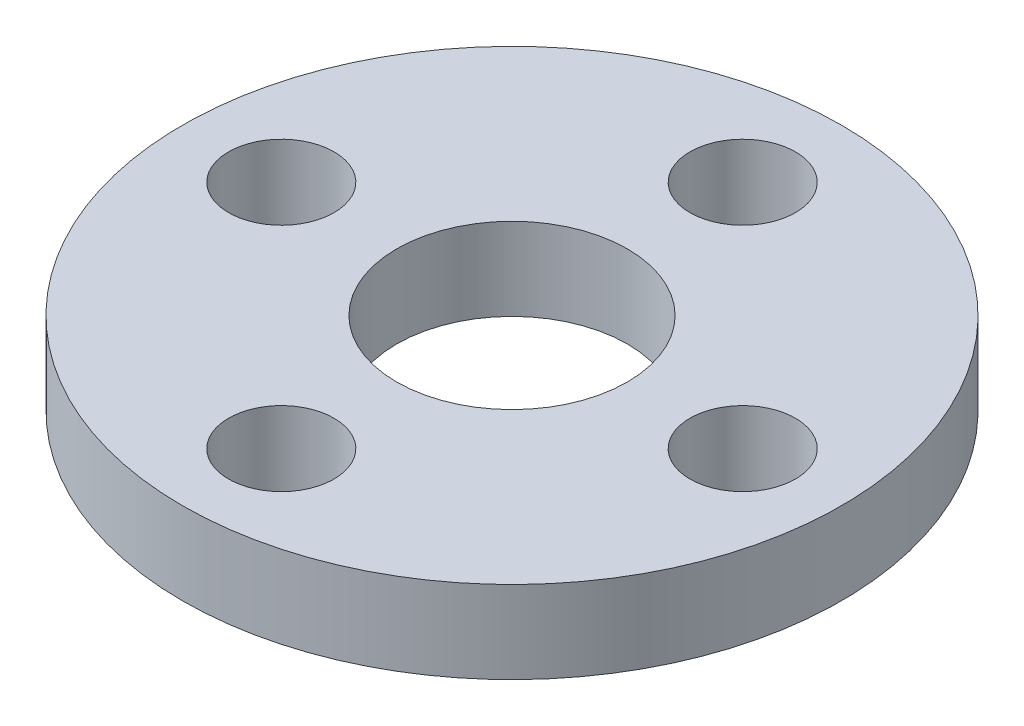
ISO-10303-21;
HEADER;
FILE_DESCRIPTION(('STEP AP214'),'2;1');
FILE_NAME('part.step','',(''),(''),'','','');
FILE_SCHEMA(('AUTOMOTIVE_DESIGN { 1 0 10303 214 1 1 1 1 }'));
ENDSEC;
DATA;
#1=APPLICATION_CONTEXT('core data for automotive mechanical design processes');
#2=APPLICATION_PROTOCOL_DEFINITION('international standard','automotive_design',2000,#1);
#3=PRODUCT_CONTEXT('',#1,'mechanical');
#4=PRODUCT('Part','Part','',(#3));
#5=PRODUCT_RELATED_PRODUCT_CATEGORY('part','',(#4));
#6=PRODUCT_DEFINITION_FORMATION('','',#4);
#7=PRODUCT_DEFINITION_CONTEXT('part definition',#1,'design');
#8=PRODUCT_DEFINITION('design','',#6,#7);
#9=PRODUCT_DEFINITION_SHAPE('','',#8);
#10=(LENGTH_UNIT() NAMED_UNIT(*) SI_UNIT(.MILLI.,.METRE.));
#11=(NAMED_UNIT(*) PLANE_ANGLE_UNIT() SI_UNIT($,.RADIAN.));
#12=(NAMED_UNIT(*) SI_UNIT($,.STERADIAN.) SOLID_ANGLE_UNIT());
#13=UNCERTAINTY_MEASURE_WITH_UNIT(LENGTH_MEASURE(1.E-05),#10,'distance_accuracy_value','');
#14=(GEOMETRIC_REPRESENTATION_CONTEXT(3) GLOBAL_UNCERTAINTY_ASSIGNED_CONTEXT((#13)) GLOBAL_UNIT_ASSIGNED_CONTEXT((#10,
#11,#12)) REPRESENTATION_CONTEXT('',''));
#15=CARTESIAN_POINT('',(0.,0.,0.));
#16=DIRECTION('',(0.,0.,1.));
#17=DIRECTION('',(1.,0.,0.));
#18=AXIS2_PLACEMENT_3D('',#15,#16,#17);
#19=CARTESIAN_POINT('',(0.,2.5,0.));
#20=DIRECTION('',(0.,1.,0.));
#21=DIRECTION('',(0.,0.,1.));
#22=AXIS2_PLACEMENT_3D('',#19,#20,#21);
#23=PLANE('',#22);
#24=CARTESIAN_POINT('',(0.,2.5,7.));
#25=DIRECTION('',(0.,1.,0.));
#26=DIRECTION('',(0.,0.,-1.));
#27=AXIS2_PLACEMENT_3D('',#24,#25,#26);
#28=CIRCLE('',#27,1.6);
#29=CARTESIAN_POINT('',(0.,2.5,5.4));
#30=VERTEX_POINT('',#29);
#31=EDGE_CURVE('E76',#30,#30,#28,.T.);
#32=ORIENTED_EDGE('',*,*,#31,.F.);
#33=EDGE_LOOP('',(#32));
#34=FACE_BOUND('',#33,.T.);
#35=CARTESIAN_POINT('',(7.,2.5,0.));
#36=DIRECTION('',(0.,1.,0.));
#37=DIRECTION('',(0.,0.,1.));
#38=AXIS2_PLACEMENT_3D('',#35,#36,#37);
#39=CIRCLE('',#38,1.6);
#40=CARTESIAN_POINT('',(7.,2.5,1.6));
#41=VERTEX_POINT('',#40);
#42=EDGE_CURVE('E60',#41,#41,#39,.T.);
#43=ORIENTED_EDGE('',*,*,#42,.F.);
#44=EDGE_LOOP('',(#43));
#45=FACE_BOUND('',#44,.T.);
#46=CARTESIAN_POINT('',(0.,2.5,0.));
#47=DIRECTION('',(0.,1.,0.));
#48=DIRECTION('',(0.,0.,1.));
#49=AXIS2_PLACEMENT_3D('',#46,#47,#48);
#50=CIRCLE('',#49,10.);
#51=CARTESIAN_POINT('',(0.,2.5,10.));
#52=VERTEX_POINT('',#51);
#53=EDGE_CURVE('E10',#52,#52,#50,.T.);
#54=ORIENTED_EDGE('',*,*,#53,.T.);
#55=EDGE_LOOP('',(#54));
#56=FACE_BOUND('',#55,.T.);
#57=CARTESIAN_POINT('',(0.,2.5,-7.));
#58=DIRECTION('',(0.,1.,0.));
#59=DIRECTION('',(0.,0.,1.));
#60=AXIS2_PLACEMENT_3D('',#57,#58,#59);
#61=CIRCLE('',#60,1.6);
#62=CARTESIAN_POINT('',(0.,2.5,-5.4));
#63=VERTEX_POINT('',#62);
#64=EDGE_CURVE('E54',#63,#63,#61,.T.);
#65=ORIENTED_EDGE('',*,*,#64,.F.);
#66=EDGE_LOOP('',(#65));
#67=FACE_BOUND('',#66,.T.);
#68=CARTESIAN_POINT('',(0.,2.5,0.));
#69=DIRECTION('',(0.,1.,0.));
#70=DIRECTION('',(0.,0.,1.));
#71=AXIS2_PLACEMENT_3D('',#68,#69,#70);
#72=CIRCLE('',#71,3.5);
#73=CARTESIAN_POINT('',(0.,2.5,3.5));
#74=VERTEX_POINT('',#73);
#75=EDGE_CURVE('E68',#74,#74,#72,.T.);
#76=ORIENTED_EDGE('',*,*,#75,.F.);
#77=EDGE_LOOP('',(#76));
#78=FACE_BOUND('',#77,.T.);
#79=CARTESIAN_POINT('',(-7.,2.5,0.));
#80=DIRECTION('',(0.,1.,0.));
#81=DIRECTION('',(0.,0.,-1.));
#82=AXIS2_PLACEMENT_3D('',#79,#80,#81);
#83=CIRCLE('',#82,1.6);
#84=CARTESIAN_POINT('',(-7.,2.5,-1.6));
#85=VERTEX_POINT('',#84);
#86=EDGE_CURVE('E84',#85,#85,#83,.T.);
#87=ORIENTED_EDGE('',*,*,#86,.F.);
#88=EDGE_LOOP('',(#87));
#89=FACE_BOUND('',#88,.T.);
#90=ADVANCED_FACE('F41',(#34,#45,#56,#67,#78,#89),#23,.T.);
#91=CARTESIAN_POINT('',(0.,0.,0.));
#92=DIRECTION('',(0.,1.,0.));
#93=DIRECTION('',(0.,0.,1.));
#94=AXIS2_PLACEMENT_3D('',#91,#92,#93);
#95=PLANE('',#94);
#96=CARTESIAN_POINT('',(0.,0.,0.));
#97=DIRECTION('',(0.,1.,0.));
#98=DIRECTION('',(0.,0.,1.));
#99=AXIS2_PLACEMENT_3D('',#96,#97,#98);
#100=CIRCLE('',#99,10.);
#101=CARTESIAN_POINT('',(0.,0.,10.));
#102=VERTEX_POINT('',#101);
#103=EDGE_CURVE('E45',#102,#102,#100,.T.);
#104=ORIENTED_EDGE('',*,*,#103,.F.);
#105=EDGE_LOOP('',(#104));
#106=FACE_BOUND('',#105,.T.);
#107=CARTESIAN_POINT('',(0.,0.,-7.));
#108=DIRECTION('',(0.,1.,0.));
#109=DIRECTION('',(0.,0.,1.));
#110=AXIS2_PLACEMENT_3D('',#107,#108,#109);
#111=CIRCLE('',#110,1.6);
#112=CARTESIAN_POINT('',(0.,0.,-5.4));
#113=VERTEX_POINT('',#112);
#114=EDGE_CURVE('E56',#113,#113,#111,.T.);
#115=ORIENTED_EDGE('',*,*,#114,.T.);
#116=EDGE_LOOP('',(#115));
#117=FACE_BOUND('',#116,.T.);
#118=CARTESIAN_POINT('',(7.,0.,0.));
#119=DIRECTION('',(0.,1.,0.));
#120=DIRECTION('',(0.,0.,1.));
#121=AXIS2_PLACEMENT_3D('',#118,#119,#120);
#122=CIRCLE('',#121,1.6);
#123=CARTESIAN_POINT('',(7.,0.,1.6));
#124=VERTEX_POINT('',#123);
#125=EDGE_CURVE('E64',#124,#124,#122,.T.);
#126=ORIENTED_EDGE('',*,*,#125,.T.);
#127=EDGE_LOOP('',(#126));
#128=FACE_BOUND('',#127,.T.);
#129=CARTESIAN_POINT('',(0.,0.,0.));
#130=DIRECTION('',(0.,1.,0.));
#131=DIRECTION('',(0.,0.,1.));
#132=AXIS2_PLACEMENT_3D('',#129,#130,#131);
#133=CIRCLE('',#132,3.5);
#134=CARTESIAN_POINT('',(0.,0.,3.5));
#135=VERTEX_POINT('',#134);
#136=EDGE_CURVE('E72',#135,#135,#133,.T.);
#137=ORIENTED_EDGE('',*,*,#136,.T.);
#138=EDGE_LOOP('',(#137));
#139=FACE_BOUND('',#138,.T.);
#140=CARTESIAN_POINT('',(0.,0.,7.));
#141=DIRECTION('',(0.,1.,0.));
#142=DIRECTION('',(0.,0.,-1.));
#143=AXIS2_PLACEMENT_3D('',#140,#141,#142);
#144=CIRCLE('',#143,1.6);
#145=CARTESIAN_POINT('',(0.,0.,5.4));
#146=VERTEX_POINT('',#145);
#147=EDGE_CURVE('E80',#146,#146,#144,.T.);
#148=ORIENTED_EDGE('',*,*,#147,.T.);
#149=EDGE_LOOP('',(#148));
#150=FACE_BOUND('',#149,.T.);
#151=CARTESIAN_POINT('',(-7.,0.,0.));
#152=DIRECTION('',(0.,1.,0.));
#153=DIRECTION('',(0.,0.,-1.));
#154=AXIS2_PLACEMENT_3D('',#151,#152,#153);
#155=CIRCLE('',#154,1.6);
#156=CARTESIAN_POINT('',(-7.,0.,-1.6));
#157=VERTEX_POINT('',#156);
#158=EDGE_CURVE('E88',#157,#157,#155,.T.);
#159=ORIENTED_EDGE('',*,*,#158,.T.);
#160=EDGE_LOOP('',(#159));
#161=FACE_BOUND('',#160,.T.);
#162=ADVANCED_FACE('F100',(#106,#117,#128,#139,#150,#161),#95,.F.);
#163=CARTESIAN_POINT('',(0.,2.5,0.));
#164=DIRECTION('',(0.,-1.,0.));
#165=DIRECTION('',(0.,0.,-1.));
#166=AXIS2_PLACEMENT_3D('',#163,#164,#165);
#167=CYLINDRICAL_SURFACE('',#166,10.);
#168=ORIENTED_EDGE('',*,*,#53,.F.);
#169=EDGE_LOOP('',(#168));
#170=FACE_BOUND('',#169,.T.);
#171=ORIENTED_EDGE('',*,*,#103,.T.);
#172=EDGE_LOOP('',(#171));
#173=FACE_BOUND('',#172,.T.);
#174=ADVANCED_FACE('F43',(#170,#173),#167,.T.);
#175=CARTESIAN_POINT('',(0.,2.5,-7.));
#176=DIRECTION('',(0.,-1.,0.));
#177=DIRECTION('',(0.,0.,-1.));
#178=AXIS2_PLACEMENT_3D('',#175,#176,#177);
#179=CYLINDRICAL_SURFACE('',#178,1.6);
#180=ORIENTED_EDGE('',*,*,#64,.T.);
#181=EDGE_LOOP('',(#180));
#182=FACE_BOUND('',#181,.T.);
#183=ORIENTED_EDGE('',*,*,#114,.F.);
#184=EDGE_LOOP('',(#183));
#185=FACE_BOUND('',#184,.T.);
#186=ADVANCED_FACE('F110',(#182,#185),#179,.F.);
#187=CARTESIAN_POINT('',(7.,2.5,0.));
#188=DIRECTION('',(0.,-1.,0.));
#189=DIRECTION('',(0.,0.,-1.));
#190=AXIS2_PLACEMENT_3D('',#187,#188,#189);
#191=CYLINDRICAL_SURFACE('',#190,1.6);
#192=ORIENTED_EDGE('',*,*,#42,.T.);
#193=EDGE_LOOP('',(#192));
#194=FACE_BOUND('',#193,.T.);
#195=ORIENTED_EDGE('',*,*,#125,.F.);
#196=EDGE_LOOP('',(#195));
#197=FACE_BOUND('',#196,.T.);
#198=ADVANCED_FACE('F113',(#194,#197),#191,.F.);
#199=CARTESIAN_POINT('',(0.,2.5,0.));
#200=DIRECTION('',(0.,-1.,0.));
#201=DIRECTION('',(0.,0.,-1.));
#202=AXIS2_PLACEMENT_3D('',#199,#200,#201);
#203=CYLINDRICAL_SURFACE('',#202,3.5);
#204=ORIENTED_EDGE('',*,*,#75,.T.);
#205=EDGE_LOOP('',(#204));
#206=FACE_BOUND('',#205,.T.);
#207=ORIENTED_EDGE('',*,*,#136,.F.);
#208=EDGE_LOOP('',(#207));
#209=FACE_BOUND('',#208,.T.);
#210=ADVANCED_FACE('F117',(#206,#209),#203,.F.);
#211=CARTESIAN_POINT('',(0.,2.5,7.));
#212=DIRECTION('',(0.,-1.,0.));
#213=DIRECTION('',(0.,0.,-1.));
#214=AXIS2_PLACEMENT_3D('',#211,#212,#213);
#215=CYLINDRICAL_SURFACE('',#214,1.6);
#216=ORIENTED_EDGE('',*,*,#31,.T.);
#217=EDGE_LOOP('',(#216));
#218=FACE_BOUND('',#217,.T.);
#219=ORIENTED_EDGE('',*,*,#147,.F.);
#220=EDGE_LOOP('',(#219));
#221=FACE_BOUND('',#220,.T.);
#222=ADVANCED_FACE('F121',(#218,#221),#215,.F.);
#223=CARTESIAN_POINT('',(-7.,2.5,0.));
#224=DIRECTION('',(0.,-1.,0.));
#225=DIRECTION('',(0.,0.,-1.));
#226=AXIS2_PLACEMENT_3D('',#223,#224,#225);
#227=CYLINDRICAL_SURFACE('',#226,1.6);
#228=ORIENTED_EDGE('',*,*,#86,.T.);
#229=EDGE_LOOP('',(#228));
#230=FACE_BOUND('',#229,.T.);
#231=ORIENTED_EDGE('',*,*,#158,.F.);
#232=EDGE_LOOP('',(#231));
#233=FACE_BOUND('',#232,.T.);
#234=ADVANCED_FACE('F96',(#230,#233),#227,.F.);
#235=CLOSED_SHELL('',(#90,#162,#174,#186,#198,#210,#222,#234));
#236=MANIFOLD_SOLID_BREP('B2',#235);
#237=ADVANCED_BREP_SHAPE_REPRESENTATION('',(#18,#236),#14);
#238=SHAPE_DEFINITION_REPRESENTATION(#9,#237);
ENDSEC;
END-ISO-10303-21;
